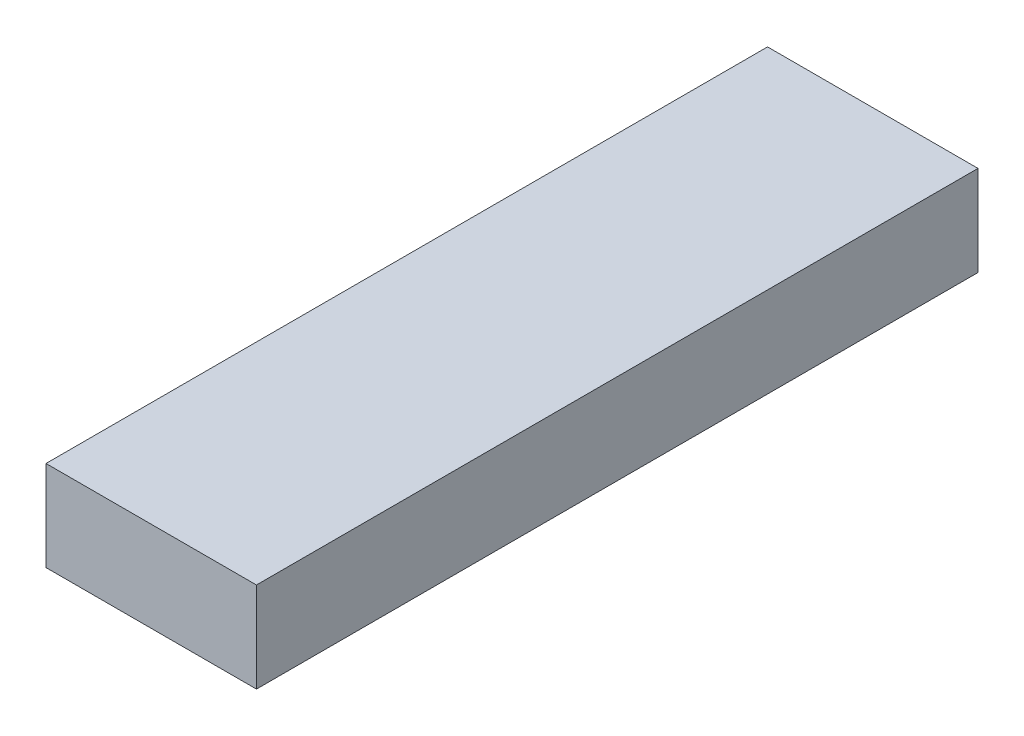
ISO-10303-21;
HEADER;
FILE_DESCRIPTION(('STEP AP214'),'2;1');
FILE_NAME('part.step','',(''),(''),'','','');
FILE_SCHEMA(('AUTOMOTIVE_DESIGN { 1 0 10303 214 1 1 1 1 }'));
ENDSEC;
DATA;
#1=APPLICATION_CONTEXT('core data for automotive mechanical design processes');
#2=APPLICATION_PROTOCOL_DEFINITION('international standard','automotive_design',2000,#1);
#3=PRODUCT_CONTEXT('',#1,'mechanical');
#4=PRODUCT('Part','Part','',(#3));
#5=PRODUCT_RELATED_PRODUCT_CATEGORY('part','',(#4));
#6=PRODUCT_DEFINITION_FORMATION('','',#4);
#7=PRODUCT_DEFINITION_CONTEXT('part definition',#1,'design');
#8=PRODUCT_DEFINITION('design','',#6,#7);
#9=PRODUCT_DEFINITION_SHAPE('','',#8);
#10=(LENGTH_UNIT() NAMED_UNIT(*) SI_UNIT(.MILLI.,.METRE.));
#11=(NAMED_UNIT(*) PLANE_ANGLE_UNIT() SI_UNIT($,.RADIAN.));
#12=(NAMED_UNIT(*) SI_UNIT($,.STERADIAN.) SOLID_ANGLE_UNIT());
#13=UNCERTAINTY_MEASURE_WITH_UNIT(LENGTH_MEASURE(1.E-05),#10,'distance_accuracy_value','');
#14=(GEOMETRIC_REPRESENTATION_CONTEXT(3) GLOBAL_UNCERTAINTY_ASSIGNED_CONTEXT((#13)) GLOBAL_UNIT_ASSIGNED_CONTEXT((#10,
#11,#12)) REPRESENTATION_CONTEXT('',''));
#15=CARTESIAN_POINT('',(0.,0.,0.));
#16=DIRECTION('',(0.,0.,1.));
#17=DIRECTION('',(1.,0.,0.));
#18=AXIS2_PLACEMENT_3D('',#15,#16,#17);
#19=CARTESIAN_POINT('',(-44.45,-19.05,304.8));
#20=DIRECTION('',(1.,0.,0.));
#21=DIRECTION('',(0.,0.,-1.));
#22=AXIS2_PLACEMENT_3D('',#19,#20,#21);
#23=PLANE('',#22);
#24=DIRECTION('',(0.,-1.,0.));
#25=VECTOR('',#24,1.);
#26=CARTESIAN_POINT('',(-44.45,-19.05,0.));
#27=LINE('',#26,#25);
#28=CARTESIAN_POINT('',(-44.45,19.05,0.));
#29=VERTEX_POINT('',#28);
#30=CARTESIAN_POINT('',(-44.45,-19.05,0.));
#31=VERTEX_POINT('',#30);
#32=EDGE_CURVE('E113',#29,#31,#27,.T.);
#33=ORIENTED_EDGE('',*,*,#32,.T.);
#34=DIRECTION('',(0.,0.,-1.));
#35=VECTOR('',#34,1.);
#36=CARTESIAN_POINT('',(-44.45,-19.05,304.8));
#37=LINE('',#36,#35);
#38=CARTESIAN_POINT('',(-44.45,-19.05,304.8));
#39=VERTEX_POINT('',#38);
#40=EDGE_CURVE('E11',#39,#31,#37,.T.);
#41=ORIENTED_EDGE('',*,*,#40,.F.);
#42=DIRECTION('',(0.,-1.,0.));
#43=VECTOR('',#42,1.);
#44=CARTESIAN_POINT('',(-44.45,-19.05,304.8));
#45=LINE('',#44,#43);
#46=CARTESIAN_POINT('',(-44.45,19.05,304.8));
#47=VERTEX_POINT('',#46);
#48=EDGE_CURVE('E95',#47,#39,#45,.T.);
#49=ORIENTED_EDGE('',*,*,#48,.F.);
#50=DIRECTION('',(0.,0.,-1.));
#51=VECTOR('',#50,1.);
#52=CARTESIAN_POINT('',(-44.45,19.05,304.8));
#53=LINE('',#52,#51);
#54=EDGE_CURVE('E109',#47,#29,#53,.T.);
#55=ORIENTED_EDGE('',*,*,#54,.T.);
#56=EDGE_LOOP('',(#33,#41,#49,#55));
#57=FACE_BOUND('',#56,.T.);
#58=ADVANCED_FACE('F43',(#57),#23,.F.);
#59=CARTESIAN_POINT('',(44.45,-19.05,304.8));
#60=DIRECTION('',(0.,1.,0.));
#61=DIRECTION('',(-1.,0.,0.));
#62=AXIS2_PLACEMENT_3D('',#59,#60,#61);
#63=PLANE('',#62);
#64=DIRECTION('',(1.,0.,0.));
#65=VECTOR('',#64,1.);
#66=CARTESIAN_POINT('',(44.45,-19.05,0.));
#67=LINE('',#66,#65);
#68=CARTESIAN_POINT('',(44.45,-19.05,0.));
#69=VERTEX_POINT('',#68);
#70=EDGE_CURVE('E100',#31,#69,#67,.T.);
#71=ORIENTED_EDGE('',*,*,#70,.T.);
#72=DIRECTION('',(0.,0.,-1.));
#73=VECTOR('',#72,1.);
#74=CARTESIAN_POINT('',(44.45,-19.05,304.8));
#75=LINE('',#74,#73);
#76=CARTESIAN_POINT('',(44.45,-19.05,304.8));
#77=VERTEX_POINT('',#76);
#78=EDGE_CURVE('E52',#77,#69,#75,.T.);
#79=ORIENTED_EDGE('',*,*,#78,.F.);
#80=DIRECTION('',(1.,0.,0.));
#81=VECTOR('',#80,1.);
#82=CARTESIAN_POINT('',(44.45,-19.05,304.8));
#83=LINE('',#82,#81);
#84=EDGE_CURVE('E90',#39,#77,#83,.T.);
#85=ORIENTED_EDGE('',*,*,#84,.F.);
#86=ORIENTED_EDGE('',*,*,#40,.T.);
#87=EDGE_LOOP('',(#71,#79,#85,#86));
#88=FACE_BOUND('',#87,.T.);
#89=ADVANCED_FACE('F99',(#88),#63,.F.);
#90=CARTESIAN_POINT('',(44.45,-19.05,304.8));
#91=DIRECTION('',(-1.,0.,0.));
#92=DIRECTION('',(0.,0.,1.));
#93=AXIS2_PLACEMENT_3D('',#90,#91,#92);
#94=PLANE('',#93);
#95=DIRECTION('',(0.,1.,0.));
#96=VECTOR('',#95,1.);
#97=CARTESIAN_POINT('',(44.45,-19.05,0.));
#98=LINE('',#97,#96);
#99=CARTESIAN_POINT('',(44.45,19.05,0.));
#100=VERTEX_POINT('',#99);
#101=EDGE_CURVE('E77',#69,#100,#98,.T.);
#102=ORIENTED_EDGE('',*,*,#101,.T.);
#103=DIRECTION('',(0.,0.,-1.));
#104=VECTOR('',#103,1.);
#105=CARTESIAN_POINT('',(44.45,19.05,304.8));
#106=LINE('',#105,#104);
#107=CARTESIAN_POINT('',(44.45,19.05,304.8));
#108=VERTEX_POINT('',#107);
#109=EDGE_CURVE('E102',#108,#100,#106,.T.);
#110=ORIENTED_EDGE('',*,*,#109,.F.);
#111=DIRECTION('',(0.,1.,0.));
#112=VECTOR('',#111,1.);
#113=CARTESIAN_POINT('',(44.45,-19.05,304.8));
#114=LINE('',#113,#112);
#115=EDGE_CURVE('E93',#77,#108,#114,.T.);
#116=ORIENTED_EDGE('',*,*,#115,.F.);
#117=ORIENTED_EDGE('',*,*,#78,.T.);
#118=EDGE_LOOP('',(#102,#110,#116,#117));
#119=FACE_BOUND('',#118,.T.);
#120=ADVANCED_FACE('F103',(#119),#94,.F.);
#121=CARTESIAN_POINT('',(44.45,19.05,304.8));
#122=DIRECTION('',(0.,-1.,0.));
#123=DIRECTION('',(1.,0.,0.));
#124=AXIS2_PLACEMENT_3D('',#121,#122,#123);
#125=PLANE('',#124);
#126=DIRECTION('',(-1.,0.,0.));
#127=VECTOR('',#126,1.);
#128=CARTESIAN_POINT('',(44.45,19.05,0.));
#129=LINE('',#128,#127);
#130=EDGE_CURVE('E83',#100,#29,#129,.T.);
#131=ORIENTED_EDGE('',*,*,#130,.T.);
#132=ORIENTED_EDGE('',*,*,#54,.F.);
#133=DIRECTION('',(-1.,0.,0.));
#134=VECTOR('',#133,1.);
#135=CARTESIAN_POINT('',(44.45,19.05,304.8));
#136=LINE('',#135,#134);
#137=EDGE_CURVE('E60',#108,#47,#136,.T.);
#138=ORIENTED_EDGE('',*,*,#137,.F.);
#139=ORIENTED_EDGE('',*,*,#109,.T.);
#140=EDGE_LOOP('',(#131,#132,#138,#139));
#141=FACE_BOUND('',#140,.T.);
#142=ADVANCED_FACE('F128',(#141),#125,.F.);
#143=CARTESIAN_POINT('',(0.,0.,304.8));
#144=DIRECTION('',(0.,0.,1.));
#145=DIRECTION('',(1.,0.,0.));
#146=AXIS2_PLACEMENT_3D('',#143,#144,#145);
#147=PLANE('',#146);
#148=ORIENTED_EDGE('',*,*,#48,.T.);
#149=ORIENTED_EDGE('',*,*,#84,.T.);
#150=ORIENTED_EDGE('',*,*,#115,.T.);
#151=ORIENTED_EDGE('',*,*,#137,.T.);
#152=EDGE_LOOP('',(#148,#149,#150,#151));
#153=FACE_BOUND('',#152,.T.);
#154=ADVANCED_FACE('F91',(#153),#147,.T.);
#155=CARTESIAN_POINT('',(0.,0.,0.));
#156=DIRECTION('',(0.,0.,1.));
#157=DIRECTION('',(1.,0.,0.));
#158=AXIS2_PLACEMENT_3D('',#155,#156,#157);
#159=PLANE('',#158);
#160=ORIENTED_EDGE('',*,*,#32,.F.);
#161=ORIENTED_EDGE('',*,*,#130,.F.);
#162=ORIENTED_EDGE('',*,*,#101,.F.);
#163=ORIENTED_EDGE('',*,*,#70,.F.);
#164=EDGE_LOOP('',(#160,#161,#162,#163));
#165=FACE_BOUND('',#164,.T.);
#166=ADVANCED_FACE('F131',(#165),#159,.F.);
#167=CLOSED_SHELL('',(#58,#89,#120,#142,#154,#166));
#168=MANIFOLD_SOLID_BREP('B2',#167);
#169=ADVANCED_BREP_SHAPE_REPRESENTATION('',(#18,#168),#14);
#170=SHAPE_DEFINITION_REPRESENTATION(#9,#169);
ENDSEC;
END-ISO-10303-21;
